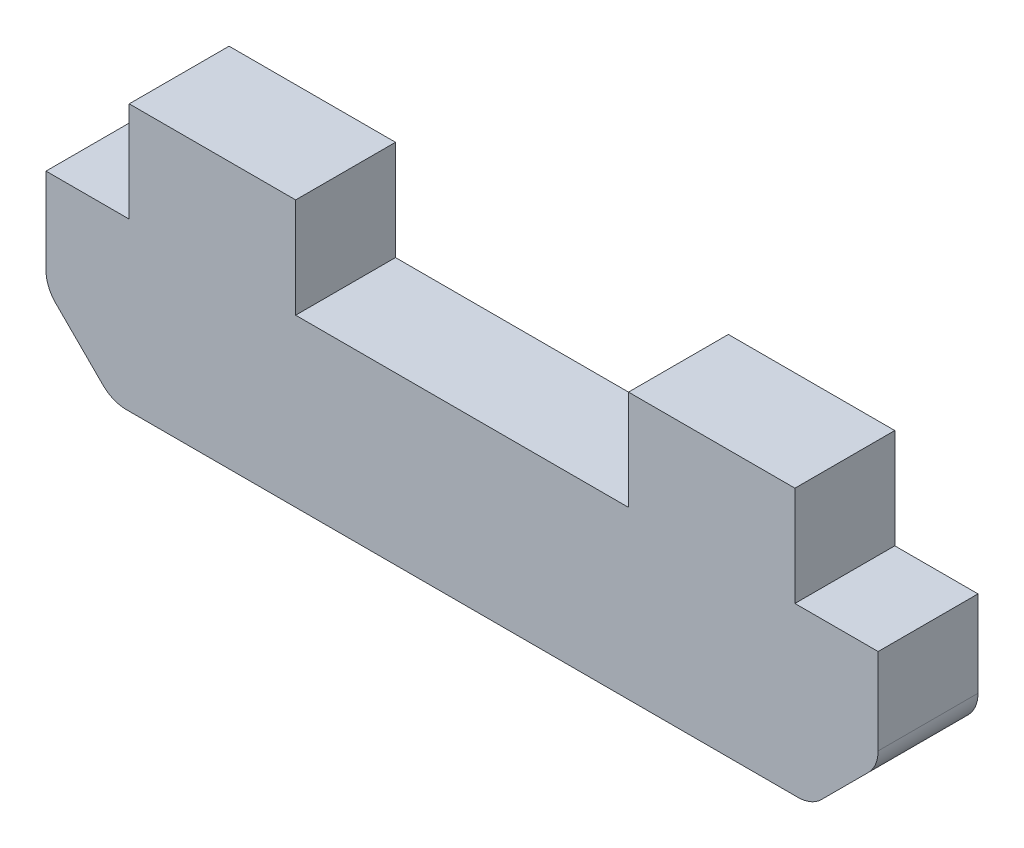
ISO-10303-21;
HEADER;
FILE_DESCRIPTION(('STEP AP214'),'2;1');
FILE_NAME('part.step','',(''),(''),'','','');
FILE_SCHEMA(('AUTOMOTIVE_DESIGN { 1 0 10303 214 1 1 1 1 }'));
ENDSEC;
DATA;
#1=APPLICATION_CONTEXT('core data for automotive mechanical design processes');
#2=APPLICATION_PROTOCOL_DEFINITION('international standard','automotive_design',2000,#1);
#3=PRODUCT_CONTEXT('',#1,'mechanical');
#4=PRODUCT('Part','Part','',(#3));
#5=PRODUCT_RELATED_PRODUCT_CATEGORY('part','',(#4));
#6=PRODUCT_DEFINITION_FORMATION('','',#4);
#7=PRODUCT_DEFINITION_CONTEXT('part definition',#1,'design');
#8=PRODUCT_DEFINITION('design','',#6,#7);
#9=PRODUCT_DEFINITION_SHAPE('','',#8);
#10=(LENGTH_UNIT() NAMED_UNIT(*) SI_UNIT(.MILLI.,.METRE.));
#11=(NAMED_UNIT(*) PLANE_ANGLE_UNIT() SI_UNIT($,.RADIAN.));
#12=(NAMED_UNIT(*) SI_UNIT($,.STERADIAN.) SOLID_ANGLE_UNIT());
#13=UNCERTAINTY_MEASURE_WITH_UNIT(LENGTH_MEASURE(1.E-05),#10,'distance_accuracy_value','');
#14=(GEOMETRIC_REPRESENTATION_CONTEXT(3) GLOBAL_UNCERTAINTY_ASSIGNED_CONTEXT((#13)) GLOBAL_UNIT_ASSIGNED_CONTEXT((#10,
#11,#12)) REPRESENTATION_CONTEXT('',''));
#15=CARTESIAN_POINT('',(0.,0.,0.));
#16=DIRECTION('',(0.,0.,1.));
#17=DIRECTION('',(1.,0.,0.));
#18=AXIS2_PLACEMENT_3D('',#15,#16,#17);
#19=CARTESIAN_POINT('',(0.,5.,3.));
#20=DIRECTION('',(1.,0.,0.));
#21=DIRECTION('',(0.,1.,0.));
#22=AXIS2_PLACEMENT_3D('',#19,#20,#21);
#23=PLANE('',#22);
#24=DIRECTION('',(0.,-1.,0.));
#25=VECTOR('',#24,1.);
#26=CARTESIAN_POINT('',(0.,5.,0.));
#27=LINE('',#26,#25);
#28=CARTESIAN_POINT('',(0.,5.,0.));
#29=VERTEX_POINT('',#28);
#30=CARTESIAN_POINT('',(0.,2.4142135623731,0.));
#31=VERTEX_POINT('',#30);
#32=EDGE_CURVE('E202',#29,#31,#27,.T.);
#33=ORIENTED_EDGE('',*,*,#32,.T.);
#34=DIRECTION('',(0.,0.,-1.));
#35=VECTOR('',#34,1.);
#36=CARTESIAN_POINT('',(0.,2.4142135623731,3.));
#37=LINE('',#36,#35);
#38=CARTESIAN_POINT('',(0.,2.4142135623731,3.));
#39=VERTEX_POINT('',#38);
#40=EDGE_CURVE('E287',#31,#39,#37,.F.);
#41=ORIENTED_EDGE('',*,*,#40,.T.);
#42=DIRECTION('',(0.,-1.,0.));
#43=VECTOR('',#42,1.);
#44=CARTESIAN_POINT('',(0.,5.,3.));
#45=LINE('',#44,#43);
#46=CARTESIAN_POINT('',(0.,5.,3.));
#47=VERTEX_POINT('',#46);
#48=EDGE_CURVE('E227',#47,#39,#45,.T.);
#49=ORIENTED_EDGE('',*,*,#48,.F.);
#50=DIRECTION('',(0.,0.,-1.));
#51=VECTOR('',#50,1.);
#52=CARTESIAN_POINT('',(0.,5.,3.));
#53=LINE('',#52,#51);
#54=EDGE_CURVE('E201',#47,#29,#53,.T.);
#55=ORIENTED_EDGE('',*,*,#54,.T.);
#56=EDGE_LOOP('',(#33,#41,#49,#55));
#57=FACE_BOUND('',#56,.T.);
#58=ADVANCED_FACE('F33',(#57),#23,.F.);
#59=CARTESIAN_POINT('',(0.,0.,3.));
#60=DIRECTION('',(0.,1.,0.));
#61=DIRECTION('',(0.,0.,1.));
#62=AXIS2_PLACEMENT_3D('',#59,#60,#61);
#63=PLANE('',#62);
#64=DIRECTION('',(1.,0.,0.));
#65=VECTOR('',#64,1.);
#66=CARTESIAN_POINT('',(0.,0.,0.));
#67=LINE('',#66,#65);
#68=CARTESIAN_POINT('',(2.41421356237309,0.,0.));
#69=VERTEX_POINT('',#68);
#70=CARTESIAN_POINT('',(22.5857864376269,0.,0.));
#71=VERTEX_POINT('',#70);
#72=EDGE_CURVE('E205',#69,#71,#67,.T.);
#73=ORIENTED_EDGE('',*,*,#72,.T.);
#74=DIRECTION('',(0.,0.,-1.));
#75=VECTOR('',#74,1.);
#76=CARTESIAN_POINT('',(22.5857864376269,0.,3.));
#77=LINE('',#76,#75);
#78=CARTESIAN_POINT('',(22.5857864376269,0.,3.));
#79=VERTEX_POINT('',#78);
#80=EDGE_CURVE('E284',#71,#79,#77,.F.);
#81=ORIENTED_EDGE('',*,*,#80,.T.);
#82=DIRECTION('',(1.,0.,0.));
#83=VECTOR('',#82,1.);
#84=CARTESIAN_POINT('',(0.,0.,3.));
#85=LINE('',#84,#83);
#86=CARTESIAN_POINT('',(2.41421356237309,0.,3.));
#87=VERTEX_POINT('',#86);
#88=EDGE_CURVE('E167',#87,#79,#85,.T.);
#89=ORIENTED_EDGE('',*,*,#88,.F.);
#90=DIRECTION('',(0.,0.,1.));
#91=VECTOR('',#90,1.);
#92=CARTESIAN_POINT('',(2.41421356237309,0.,0.));
#93=LINE('',#92,#91);
#94=EDGE_CURVE('E281',#87,#69,#93,.F.);
#95=ORIENTED_EDGE('',*,*,#94,.T.);
#96=EDGE_LOOP('',(#73,#81,#89,#95));
#97=FACE_BOUND('',#96,.T.);
#98=ADVANCED_FACE('F304',(#97),#63,.F.);
#99=CARTESIAN_POINT('',(25.,0.,3.));
#100=DIRECTION('',(-1.,0.,0.));
#101=DIRECTION('',(0.,0.,1.));
#102=AXIS2_PLACEMENT_3D('',#99,#100,#101);
#103=PLANE('',#102);
#104=DIRECTION('',(0.,1.,0.));
#105=VECTOR('',#104,1.);
#106=CARTESIAN_POINT('',(25.,0.,3.));
#107=LINE('',#106,#105);
#108=CARTESIAN_POINT('',(25.,2.4142135623731,3.));
#109=VERTEX_POINT('',#108);
#110=CARTESIAN_POINT('',(25.,5.,3.));
#111=VERTEX_POINT('',#110);
#112=EDGE_CURVE('E155',#109,#111,#107,.T.);
#113=ORIENTED_EDGE('',*,*,#112,.F.);
#114=DIRECTION('',(0.,0.,1.));
#115=VECTOR('',#114,1.);
#116=CARTESIAN_POINT('',(25.,2.4142135623731,0.));
#117=LINE('',#116,#115);
#118=CARTESIAN_POINT('',(25.,2.4142135623731,0.));
#119=VERTEX_POINT('',#118);
#120=EDGE_CURVE('E261',#109,#119,#117,.F.);
#121=ORIENTED_EDGE('',*,*,#120,.T.);
#122=DIRECTION('',(0.,1.,0.));
#123=VECTOR('',#122,1.);
#124=CARTESIAN_POINT('',(25.,0.,0.));
#125=LINE('',#124,#123);
#126=CARTESIAN_POINT('',(25.,5.,0.));
#127=VERTEX_POINT('',#126);
#128=EDGE_CURVE('E173',#119,#127,#125,.T.);
#129=ORIENTED_EDGE('',*,*,#128,.T.);
#130=DIRECTION('',(0.,0.,-1.));
#131=VECTOR('',#130,1.);
#132=CARTESIAN_POINT('',(25.,5.,3.));
#133=LINE('',#132,#131);
#134=EDGE_CURVE('E170',#111,#127,#133,.T.);
#135=ORIENTED_EDGE('',*,*,#134,.F.);
#136=EDGE_LOOP('',(#113,#121,#129,#135));
#137=FACE_BOUND('',#136,.T.);
#138=ADVANCED_FACE('F171',(#137),#103,.F.);
#139=CARTESIAN_POINT('',(25.,5.,3.));
#140=DIRECTION('',(0.,-1.,0.));
#141=DIRECTION('',(1.,0.,0.));
#142=AXIS2_PLACEMENT_3D('',#139,#140,#141);
#143=PLANE('',#142);
#144=DIRECTION('',(-1.,0.,0.));
#145=VECTOR('',#144,1.);
#146=CARTESIAN_POINT('',(25.,5.,0.));
#147=LINE('',#146,#145);
#148=CARTESIAN_POINT('',(22.5,5.,0.));
#149=VERTEX_POINT('',#148);
#150=EDGE_CURVE('E209',#127,#149,#147,.T.);
#151=ORIENTED_EDGE('',*,*,#150,.T.);
#152=DIRECTION('',(0.,0.,-1.));
#153=VECTOR('',#152,1.);
#154=CARTESIAN_POINT('',(22.5,5.,3.));
#155=LINE('',#154,#153);
#156=CARTESIAN_POINT('',(22.5,5.,3.));
#157=VERTEX_POINT('',#156);
#158=EDGE_CURVE('E177',#157,#149,#155,.T.);
#159=ORIENTED_EDGE('',*,*,#158,.F.);
#160=DIRECTION('',(-1.,0.,0.));
#161=VECTOR('',#160,1.);
#162=CARTESIAN_POINT('',(25.,5.,3.));
#163=LINE('',#162,#161);
#164=EDGE_CURVE('E160',#111,#157,#163,.T.);
#165=ORIENTED_EDGE('',*,*,#164,.F.);
#166=ORIENTED_EDGE('',*,*,#134,.T.);
#167=EDGE_LOOP('',(#151,#159,#165,#166));
#168=FACE_BOUND('',#167,.T.);
#169=ADVANCED_FACE('F179',(#168),#143,.F.);
#170=CARTESIAN_POINT('',(22.5,5.,3.));
#171=DIRECTION('',(-1.,0.,0.));
#172=DIRECTION('',(0.,0.,1.));
#173=AXIS2_PLACEMENT_3D('',#170,#171,#172);
#174=PLANE('',#173);
#175=DIRECTION('',(0.,1.,0.));
#176=VECTOR('',#175,1.);
#177=CARTESIAN_POINT('',(22.5,5.,0.));
#178=LINE('',#177,#176);
#179=CARTESIAN_POINT('',(22.5,8.,0.));
#180=VERTEX_POINT('',#179);
#181=EDGE_CURVE('E211',#149,#180,#178,.T.);
#182=ORIENTED_EDGE('',*,*,#181,.T.);
#183=DIRECTION('',(0.,0.,-1.));
#184=VECTOR('',#183,1.);
#185=CARTESIAN_POINT('',(22.5,8.,3.));
#186=LINE('',#185,#184);
#187=CARTESIAN_POINT('',(22.5,8.,3.));
#188=VERTEX_POINT('',#187);
#189=EDGE_CURVE('E248',#188,#180,#186,.T.);
#190=ORIENTED_EDGE('',*,*,#189,.F.);
#191=DIRECTION('',(0.,1.,0.));
#192=VECTOR('',#191,1.);
#193=CARTESIAN_POINT('',(22.5,5.,3.));
#194=LINE('',#193,#192);
#195=EDGE_CURVE('E182',#157,#188,#194,.T.);
#196=ORIENTED_EDGE('',*,*,#195,.F.);
#197=ORIENTED_EDGE('',*,*,#158,.T.);
#198=EDGE_LOOP('',(#182,#190,#196,#197));
#199=FACE_BOUND('',#198,.T.);
#200=ADVANCED_FACE('F349',(#199),#174,.F.);
#201=CARTESIAN_POINT('',(22.5,8.,3.));
#202=DIRECTION('',(0.,-1.,0.));
#203=DIRECTION('',(0.,0.,-1.));
#204=AXIS2_PLACEMENT_3D('',#201,#202,#203);
#205=PLANE('',#204);
#206=DIRECTION('',(-1.,0.,0.));
#207=VECTOR('',#206,1.);
#208=CARTESIAN_POINT('',(22.5,8.,0.));
#209=LINE('',#208,#207);
#210=CARTESIAN_POINT('',(17.5,8.,0.));
#211=VERTEX_POINT('',#210);
#212=EDGE_CURVE('E213',#180,#211,#209,.T.);
#213=ORIENTED_EDGE('',*,*,#212,.T.);
#214=DIRECTION('',(0.,0.,-1.));
#215=VECTOR('',#214,1.);
#216=CARTESIAN_POINT('',(17.5,8.,3.));
#217=LINE('',#216,#215);
#218=CARTESIAN_POINT('',(17.5,8.,3.));
#219=VERTEX_POINT('',#218);
#220=EDGE_CURVE('E245',#219,#211,#217,.T.);
#221=ORIENTED_EDGE('',*,*,#220,.F.);
#222=DIRECTION('',(-1.,0.,0.));
#223=VECTOR('',#222,1.);
#224=CARTESIAN_POINT('',(22.5,8.,3.));
#225=LINE('',#224,#223);
#226=EDGE_CURVE('E184',#188,#219,#225,.T.);
#227=ORIENTED_EDGE('',*,*,#226,.F.);
#228=ORIENTED_EDGE('',*,*,#189,.T.);
#229=EDGE_LOOP('',(#213,#221,#227,#228));
#230=FACE_BOUND('',#229,.T.);
#231=ADVANCED_FACE('F345',(#230),#205,.F.);
#232=CARTESIAN_POINT('',(17.5,8.,3.));
#233=DIRECTION('',(1.,0.,0.));
#234=DIRECTION('',(0.,0.,-1.));
#235=AXIS2_PLACEMENT_3D('',#232,#233,#234);
#236=PLANE('',#235);
#237=DIRECTION('',(0.,-1.,0.));
#238=VECTOR('',#237,1.);
#239=CARTESIAN_POINT('',(17.5,8.,0.));
#240=LINE('',#239,#238);
#241=CARTESIAN_POINT('',(17.5,5.,0.));
#242=VERTEX_POINT('',#241);
#243=EDGE_CURVE('E215',#211,#242,#240,.T.);
#244=ORIENTED_EDGE('',*,*,#243,.T.);
#245=DIRECTION('',(0.,0.,-1.));
#246=VECTOR('',#245,1.);
#247=CARTESIAN_POINT('',(17.5,5.,3.));
#248=LINE('',#247,#246);
#249=CARTESIAN_POINT('',(17.5,5.,3.));
#250=VERTEX_POINT('',#249);
#251=EDGE_CURVE('E242',#250,#242,#248,.T.);
#252=ORIENTED_EDGE('',*,*,#251,.F.);
#253=DIRECTION('',(0.,-1.,0.));
#254=VECTOR('',#253,1.);
#255=CARTESIAN_POINT('',(17.5,8.,3.));
#256=LINE('',#255,#254);
#257=EDGE_CURVE('E189',#219,#250,#256,.T.);
#258=ORIENTED_EDGE('',*,*,#257,.F.);
#259=ORIENTED_EDGE('',*,*,#220,.T.);
#260=EDGE_LOOP('',(#244,#252,#258,#259));
#261=FACE_BOUND('',#260,.T.);
#262=ADVANCED_FACE('F340',(#261),#236,.F.);
#263=CARTESIAN_POINT('',(17.5,5.,3.));
#264=DIRECTION('',(0.,-1.,0.));
#265=DIRECTION('',(0.,0.,-1.));
#266=AXIS2_PLACEMENT_3D('',#263,#264,#265);
#267=PLANE('',#266);
#268=DIRECTION('',(-1.,0.,0.));
#269=VECTOR('',#268,1.);
#270=CARTESIAN_POINT('',(17.5,5.,0.));
#271=LINE('',#270,#269);
#272=CARTESIAN_POINT('',(7.5,5.,0.));
#273=VERTEX_POINT('',#272);
#274=EDGE_CURVE('E217',#242,#273,#271,.T.);
#275=ORIENTED_EDGE('',*,*,#274,.T.);
#276=DIRECTION('',(0.,0.,-1.));
#277=VECTOR('',#276,1.);
#278=CARTESIAN_POINT('',(7.5,5.,3.));
#279=LINE('',#278,#277);
#280=CARTESIAN_POINT('',(7.5,5.,3.));
#281=VERTEX_POINT('',#280);
#282=EDGE_CURVE('E239',#281,#273,#279,.T.);
#283=ORIENTED_EDGE('',*,*,#282,.F.);
#284=DIRECTION('',(-1.,0.,0.));
#285=VECTOR('',#284,1.);
#286=CARTESIAN_POINT('',(17.5,5.,3.));
#287=LINE('',#286,#285);
#288=EDGE_CURVE('E191',#250,#281,#287,.T.);
#289=ORIENTED_EDGE('',*,*,#288,.F.);
#290=ORIENTED_EDGE('',*,*,#251,.T.);
#291=EDGE_LOOP('',(#275,#283,#289,#290));
#292=FACE_BOUND('',#291,.T.);
#293=ADVANCED_FACE('F336',(#292),#267,.F.);
#294=CARTESIAN_POINT('',(7.5,5.,3.));
#295=DIRECTION('',(-1.,0.,0.));
#296=DIRECTION('',(0.,-1.,0.));
#297=AXIS2_PLACEMENT_3D('',#294,#295,#296);
#298=PLANE('',#297);
#299=DIRECTION('',(0.,1.,0.));
#300=VECTOR('',#299,1.);
#301=CARTESIAN_POINT('',(7.5,5.,0.));
#302=LINE('',#301,#300);
#303=CARTESIAN_POINT('',(7.5,8.,0.));
#304=VERTEX_POINT('',#303);
#305=EDGE_CURVE('E219',#273,#304,#302,.T.);
#306=ORIENTED_EDGE('',*,*,#305,.T.);
#307=DIRECTION('',(0.,0.,-1.));
#308=VECTOR('',#307,1.);
#309=CARTESIAN_POINT('',(7.5,8.,3.));
#310=LINE('',#309,#308);
#311=CARTESIAN_POINT('',(7.5,8.,3.));
#312=VERTEX_POINT('',#311);
#313=EDGE_CURVE('E236',#312,#304,#310,.T.);
#314=ORIENTED_EDGE('',*,*,#313,.F.);
#315=DIRECTION('',(0.,1.,0.));
#316=VECTOR('',#315,1.);
#317=CARTESIAN_POINT('',(7.5,5.,3.));
#318=LINE('',#317,#316);
#319=EDGE_CURVE('E193',#281,#312,#318,.T.);
#320=ORIENTED_EDGE('',*,*,#319,.F.);
#321=ORIENTED_EDGE('',*,*,#282,.T.);
#322=EDGE_LOOP('',(#306,#314,#320,#321));
#323=FACE_BOUND('',#322,.T.);
#324=ADVANCED_FACE('F331',(#323),#298,.F.);
#325=CARTESIAN_POINT('',(7.5,8.,3.));
#326=DIRECTION('',(0.,-1.,0.));
#327=DIRECTION('',(1.,0.,0.));
#328=AXIS2_PLACEMENT_3D('',#325,#326,#327);
#329=PLANE('',#328);
#330=DIRECTION('',(-1.,0.,0.));
#331=VECTOR('',#330,1.);
#332=CARTESIAN_POINT('',(7.5,8.,0.));
#333=LINE('',#332,#331);
#334=CARTESIAN_POINT('',(2.5,8.,0.));
#335=VERTEX_POINT('',#334);
#336=EDGE_CURVE('E221',#304,#335,#333,.T.);
#337=ORIENTED_EDGE('',*,*,#336,.T.);
#338=DIRECTION('',(0.,0.,-1.));
#339=VECTOR('',#338,1.);
#340=CARTESIAN_POINT('',(2.5,8.,3.));
#341=LINE('',#340,#339);
#342=CARTESIAN_POINT('',(2.5,8.,3.));
#343=VERTEX_POINT('',#342);
#344=EDGE_CURVE('E233',#343,#335,#341,.T.);
#345=ORIENTED_EDGE('',*,*,#344,.F.);
#346=DIRECTION('',(-1.,0.,0.));
#347=VECTOR('',#346,1.);
#348=CARTESIAN_POINT('',(7.5,8.,3.));
#349=LINE('',#348,#347);
#350=EDGE_CURVE('E195',#312,#343,#349,.T.);
#351=ORIENTED_EDGE('',*,*,#350,.F.);
#352=ORIENTED_EDGE('',*,*,#313,.T.);
#353=EDGE_LOOP('',(#337,#345,#351,#352));
#354=FACE_BOUND('',#353,.T.);
#355=ADVANCED_FACE('F325',(#354),#329,.F.);
#356=CARTESIAN_POINT('',(2.5,8.,3.));
#357=DIRECTION('',(1.,0.,0.));
#358=DIRECTION('',(0.,1.,0.));
#359=AXIS2_PLACEMENT_3D('',#356,#357,#358);
#360=PLANE('',#359);
#361=DIRECTION('',(0.,-1.,0.));
#362=VECTOR('',#361,1.);
#363=CARTESIAN_POINT('',(2.5,8.,0.));
#364=LINE('',#363,#362);
#365=CARTESIAN_POINT('',(2.5,5.,0.));
#366=VERTEX_POINT('',#365);
#367=EDGE_CURVE('E223',#335,#366,#364,.T.);
#368=ORIENTED_EDGE('',*,*,#367,.T.);
#369=DIRECTION('',(0.,0.,-1.));
#370=VECTOR('',#369,1.);
#371=CARTESIAN_POINT('',(2.5,5.,3.));
#372=LINE('',#371,#370);
#373=CARTESIAN_POINT('',(2.5,5.,3.));
#374=VERTEX_POINT('',#373);
#375=EDGE_CURVE('E230',#374,#366,#372,.T.);
#376=ORIENTED_EDGE('',*,*,#375,.F.);
#377=DIRECTION('',(0.,-1.,0.));
#378=VECTOR('',#377,1.);
#379=CARTESIAN_POINT('',(2.5,8.,3.));
#380=LINE('',#379,#378);
#381=EDGE_CURVE('E197',#343,#374,#380,.T.);
#382=ORIENTED_EDGE('',*,*,#381,.F.);
#383=ORIENTED_EDGE('',*,*,#344,.T.);
#384=EDGE_LOOP('',(#368,#376,#382,#383));
#385=FACE_BOUND('',#384,.T.);
#386=ADVANCED_FACE('F321',(#385),#360,.F.);
#387=CARTESIAN_POINT('',(2.5,5.,3.));
#388=DIRECTION('',(0.,-1.,0.));
#389=DIRECTION('',(1.,0.,0.));
#390=AXIS2_PLACEMENT_3D('',#387,#388,#389);
#391=PLANE('',#390);
#392=DIRECTION('',(-1.,0.,0.));
#393=VECTOR('',#392,1.);
#394=CARTESIAN_POINT('',(2.5,5.,0.));
#395=LINE('',#394,#393);
#396=EDGE_CURVE('E225',#366,#29,#395,.T.);
#397=ORIENTED_EDGE('',*,*,#396,.T.);
#398=ORIENTED_EDGE('',*,*,#54,.F.);
#399=DIRECTION('',(-1.,0.,0.));
#400=VECTOR('',#399,1.);
#401=CARTESIAN_POINT('',(2.5,5.,3.));
#402=LINE('',#401,#400);
#403=EDGE_CURVE('E199',#374,#47,#402,.T.);
#404=ORIENTED_EDGE('',*,*,#403,.F.);
#405=ORIENTED_EDGE('',*,*,#375,.T.);
#406=EDGE_LOOP('',(#397,#398,#404,#405));
#407=FACE_BOUND('',#406,.T.);
#408=ADVANCED_FACE('F317',(#407),#391,.F.);
#409=CARTESIAN_POINT('',(0.,0.,3.));
#410=DIRECTION('',(0.,0.,1.));
#411=DIRECTION('',(1.,0.,0.));
#412=AXIS2_PLACEMENT_3D('',#409,#410,#411);
#413=PLANE('',#412);
#414=DIRECTION('',(-0.707106781186549,-0.707106781186546,0.));
#415=VECTOR('',#414,1.);
#416=CARTESIAN_POINT('',(11.5,-11.5,3.));
#417=LINE('',#416,#415);
#418=CARTESIAN_POINT('',(23.2928932188134,0.292893218813451,3.));
#419=VERTEX_POINT('',#418);
#420=CARTESIAN_POINT('',(24.7071067811865,1.70710678118655,3.));
#421=VERTEX_POINT('',#420);
#422=EDGE_CURVE('E259',#419,#421,#417,.F.);
#423=ORIENTED_EDGE('',*,*,#422,.T.);
#424=CARTESIAN_POINT('',(24.,2.4142135623731,3.));
#425=DIRECTION('',(0.,0.,1.));
#426=DIRECTION('',(1.,0.,0.));
#427=AXIS2_PLACEMENT_3D('',#424,#425,#426);
#428=CIRCLE('',#427,1.);
#429=EDGE_CURVE('E163',#421,#109,#428,.T.);
#430=ORIENTED_EDGE('',*,*,#429,.T.);
#431=ORIENTED_EDGE('',*,*,#112,.T.);
#432=ORIENTED_EDGE('',*,*,#164,.T.);
#433=ORIENTED_EDGE('',*,*,#195,.T.);
#434=ORIENTED_EDGE('',*,*,#226,.T.);
#435=ORIENTED_EDGE('',*,*,#257,.T.);
#436=ORIENTED_EDGE('',*,*,#288,.T.);
#437=ORIENTED_EDGE('',*,*,#319,.T.);
#438=ORIENTED_EDGE('',*,*,#350,.T.);
#439=ORIENTED_EDGE('',*,*,#381,.T.);
#440=ORIENTED_EDGE('',*,*,#403,.T.);
#441=ORIENTED_EDGE('',*,*,#48,.T.);
#442=CARTESIAN_POINT('',(1.,2.4142135623731,3.));
#443=DIRECTION('',(0.,0.,1.));
#444=DIRECTION('',(1.,0.,0.));
#445=AXIS2_PLACEMENT_3D('',#442,#443,#444);
#446=CIRCLE('',#445,1.);
#447=CARTESIAN_POINT('',(0.29289321881345,1.70710678118656,3.));
#448=VERTEX_POINT('',#447);
#449=EDGE_CURVE('E54',#39,#448,#446,.T.);
#450=ORIENTED_EDGE('',*,*,#449,.T.);
#451=DIRECTION('',(-0.707106781186546,0.707106781186549,0.));
#452=VECTOR('',#451,1.);
#453=CARTESIAN_POINT('',(1.,0.999999999999999,3.));
#454=LINE('',#453,#452);
#455=CARTESIAN_POINT('',(1.70710678118655,0.292893218813454,3.));
#456=VERTEX_POINT('',#455);
#457=EDGE_CURVE('E257',#448,#456,#454,.F.);
#458=ORIENTED_EDGE('',*,*,#457,.T.);
#459=CARTESIAN_POINT('',(2.41421356237309,1.,3.));
#460=DIRECTION('',(0.,0.,1.));
#461=DIRECTION('',(1.,0.,0.));
#462=AXIS2_PLACEMENT_3D('',#459,#460,#461);
#463=CIRCLE('',#462,1.);
#464=EDGE_CURVE('E275',#456,#87,#463,.T.);
#465=ORIENTED_EDGE('',*,*,#464,.T.);
#466=ORIENTED_EDGE('',*,*,#88,.T.);
#467=CARTESIAN_POINT('',(22.5857864376269,1.,3.));
#468=DIRECTION('',(0.,0.,1.));
#469=DIRECTION('',(1.,0.,0.));
#470=AXIS2_PLACEMENT_3D('',#467,#468,#469);
#471=CIRCLE('',#470,1.);
#472=EDGE_CURVE('E278',#79,#419,#471,.T.);
#473=ORIENTED_EDGE('',*,*,#472,.T.);
#474=EDGE_LOOP('',(#423,#430,#431,#432,#433,#434,#435,#436,#437,#438,#439,#440,#441,#450,#458,
#465,#466,#473));
#475=FACE_BOUND('',#474,.T.);
#476=ADVANCED_FACE('F158',(#475),#413,.T.);
#477=CARTESIAN_POINT('',(0.,0.,0.));
#478=DIRECTION('',(0.,0.,1.));
#479=DIRECTION('',(1.,0.,0.));
#480=AXIS2_PLACEMENT_3D('',#477,#478,#479);
#481=PLANE('',#480);
#482=ORIENTED_EDGE('',*,*,#128,.F.);
#483=CARTESIAN_POINT('',(24.,2.4142135623731,0.));
#484=DIRECTION('',(0.,0.,1.));
#485=DIRECTION('',(1.,0.,0.));
#486=AXIS2_PLACEMENT_3D('',#483,#484,#485);
#487=CIRCLE('',#486,1.);
#488=CARTESIAN_POINT('',(24.7071067811865,1.70710678118655,0.));
#489=VERTEX_POINT('',#488);
#490=EDGE_CURVE('E269',#119,#489,#487,.F.);
#491=ORIENTED_EDGE('',*,*,#490,.T.);
#492=DIRECTION('',(0.707106781186549,0.707106781186546,0.));
#493=VECTOR('',#492,1.);
#494=CARTESIAN_POINT('',(25.,2.00000000000001,0.));
#495=LINE('',#494,#493);
#496=CARTESIAN_POINT('',(23.2928932188134,0.292893218813451,0.));
#497=VERTEX_POINT('',#496);
#498=EDGE_CURVE('E254',#489,#497,#495,.F.);
#499=ORIENTED_EDGE('',*,*,#498,.T.);
#500=CARTESIAN_POINT('',(22.5857864376269,1.,0.));
#501=DIRECTION('',(0.,0.,1.));
#502=DIRECTION('',(1.,0.,0.));
#503=AXIS2_PLACEMENT_3D('',#500,#501,#502);
#504=CIRCLE('',#503,1.);
#505=EDGE_CURVE('E267',#497,#71,#504,.F.);
#506=ORIENTED_EDGE('',*,*,#505,.T.);
#507=ORIENTED_EDGE('',*,*,#72,.F.);
#508=CARTESIAN_POINT('',(2.41421356237309,1.,0.));
#509=DIRECTION('',(0.,0.,1.));
#510=DIRECTION('',(1.,0.,0.));
#511=AXIS2_PLACEMENT_3D('',#508,#509,#510);
#512=CIRCLE('',#511,1.);
#513=CARTESIAN_POINT('',(1.70710678118655,0.292893218813454,0.));
#514=VERTEX_POINT('',#513);
#515=EDGE_CURVE('E263',#69,#514,#512,.F.);
#516=ORIENTED_EDGE('',*,*,#515,.T.);
#517=DIRECTION('',(0.707106781186546,-0.707106781186549,0.));
#518=VECTOR('',#517,1.);
#519=CARTESIAN_POINT('',(2.,0.,0.));
#520=LINE('',#519,#518);
#521=CARTESIAN_POINT('',(0.29289321881345,1.70710678118656,0.));
#522=VERTEX_POINT('',#521);
#523=EDGE_CURVE('E176',#514,#522,#520,.F.);
#524=ORIENTED_EDGE('',*,*,#523,.T.);
#525=CARTESIAN_POINT('',(1.,2.4142135623731,0.));
#526=DIRECTION('',(0.,0.,1.));
#527=DIRECTION('',(1.,0.,0.));
#528=AXIS2_PLACEMENT_3D('',#525,#526,#527);
#529=CIRCLE('',#528,1.);
#530=EDGE_CURVE('E265',#522,#31,#529,.F.);
#531=ORIENTED_EDGE('',*,*,#530,.T.);
#532=ORIENTED_EDGE('',*,*,#32,.F.);
#533=ORIENTED_EDGE('',*,*,#396,.F.);
#534=ORIENTED_EDGE('',*,*,#367,.F.);
#535=ORIENTED_EDGE('',*,*,#336,.F.);
#536=ORIENTED_EDGE('',*,*,#305,.F.);
#537=ORIENTED_EDGE('',*,*,#274,.F.);
#538=ORIENTED_EDGE('',*,*,#243,.F.);
#539=ORIENTED_EDGE('',*,*,#212,.F.);
#540=ORIENTED_EDGE('',*,*,#181,.F.);
#541=ORIENTED_EDGE('',*,*,#150,.F.);
#542=EDGE_LOOP('',(#482,#491,#499,#506,#507,#516,#524,#531,#532,#533,#534,#535,#536,#537,#538,
#539,#540,#541));
#543=FACE_BOUND('',#542,.T.);
#544=ADVANCED_FACE('F309',(#543),#481,.F.);
#545=CARTESIAN_POINT('',(25.,2.00000000000001,3.));
#546=DIRECTION('',(-0.707106781186546,0.707106781186549,0.));
#547=DIRECTION('',(0.,0.,-1.));
#548=AXIS2_PLACEMENT_3D('',#545,#546,#547);
#549=PLANE('',#548);
#550=ORIENTED_EDGE('',*,*,#498,.F.);
#551=DIRECTION('',(0.,0.,-1.));
#552=VECTOR('',#551,1.);
#553=CARTESIAN_POINT('',(24.7071067811865,1.70710678118655,3.));
#554=LINE('',#553,#552);
#555=EDGE_CURVE('E273',#489,#421,#554,.F.);
#556=ORIENTED_EDGE('',*,*,#555,.T.);
#557=ORIENTED_EDGE('',*,*,#422,.F.);
#558=DIRECTION('',(0.,0.,1.));
#559=VECTOR('',#558,1.);
#560=CARTESIAN_POINT('',(23.2928932188134,0.292893218813452,0.));
#561=LINE('',#560,#559);
#562=EDGE_CURVE('E271',#419,#497,#561,.F.);
#563=ORIENTED_EDGE('',*,*,#562,.T.);
#564=EDGE_LOOP('',(#550,#556,#557,#563));
#565=FACE_BOUND('',#564,.T.);
#566=ADVANCED_FACE('F367',(#565),#549,.F.);
#567=CARTESIAN_POINT('',(2.,0.,3.));
#568=DIRECTION('',(0.707106781186549,0.707106781186546,0.));
#569=DIRECTION('',(0.,0.,-1.));
#570=AXIS2_PLACEMENT_3D('',#567,#568,#569);
#571=PLANE('',#570);
#572=ORIENTED_EDGE('',*,*,#457,.F.);
#573=DIRECTION('',(0.,0.,1.));
#574=VECTOR('',#573,1.);
#575=CARTESIAN_POINT('',(0.292893218813451,1.70710678118656,0.));
#576=LINE('',#575,#574);
#577=EDGE_CURVE('E11',#448,#522,#576,.F.);
#578=ORIENTED_EDGE('',*,*,#577,.T.);
#579=ORIENTED_EDGE('',*,*,#523,.F.);
#580=DIRECTION('',(0.,0.,-1.));
#581=VECTOR('',#580,1.);
#582=CARTESIAN_POINT('',(1.70710678118655,0.292893218813454,3.));
#583=LINE('',#582,#581);
#584=EDGE_CURVE('E41',#514,#456,#583,.F.);
#585=ORIENTED_EDGE('',*,*,#584,.T.);
#586=EDGE_LOOP('',(#572,#578,#579,#585));
#587=FACE_BOUND('',#586,.T.);
#588=ADVANCED_FACE('F310',(#587),#571,.F.);
#589=CARTESIAN_POINT('',(24.,2.4142135623731,3.));
#590=DIRECTION('',(0.,0.,-1.));
#591=DIRECTION('',(-1.,0.,0.));
#592=AXIS2_PLACEMENT_3D('',#589,#590,#591);
#593=CYLINDRICAL_SURFACE('',#592,1.);
#594=ORIENTED_EDGE('',*,*,#429,.F.);
#595=ORIENTED_EDGE('',*,*,#555,.F.);
#596=ORIENTED_EDGE('',*,*,#490,.F.);
#597=ORIENTED_EDGE('',*,*,#120,.F.);
#598=EDGE_LOOP('',(#594,#595,#596,#597));
#599=FACE_BOUND('',#598,.T.);
#600=ADVANCED_FACE('F373',(#599),#593,.T.);
#601=CARTESIAN_POINT('',(22.5857864376269,1.,3.));
#602=DIRECTION('',(0.,0.,1.));
#603=DIRECTION('',(1.,0.,0.));
#604=AXIS2_PLACEMENT_3D('',#601,#602,#603);
#605=CYLINDRICAL_SURFACE('',#604,1.);
#606=ORIENTED_EDGE('',*,*,#505,.F.);
#607=ORIENTED_EDGE('',*,*,#562,.F.);
#608=ORIENTED_EDGE('',*,*,#472,.F.);
#609=ORIENTED_EDGE('',*,*,#80,.F.);
#610=EDGE_LOOP('',(#606,#607,#608,#609));
#611=FACE_BOUND('',#610,.T.);
#612=ADVANCED_FACE('F376',(#611),#605,.T.);
#613=CARTESIAN_POINT('',(1.,2.4142135623731,3.));
#614=DIRECTION('',(0.,0.,1.));
#615=DIRECTION('',(1.,0.,0.));
#616=AXIS2_PLACEMENT_3D('',#613,#614,#615);
#617=CYLINDRICAL_SURFACE('',#616,1.);
#618=ORIENTED_EDGE('',*,*,#530,.F.);
#619=ORIENTED_EDGE('',*,*,#577,.F.);
#620=ORIENTED_EDGE('',*,*,#449,.F.);
#621=ORIENTED_EDGE('',*,*,#40,.F.);
#622=EDGE_LOOP('',(#618,#619,#620,#621));
#623=FACE_BOUND('',#622,.T.);
#624=ADVANCED_FACE('F312',(#623),#617,.T.);
#625=CARTESIAN_POINT('',(2.41421356237309,1.,3.));
#626=DIRECTION('',(0.,0.,-1.));
#627=DIRECTION('',(-1.,0.,0.));
#628=AXIS2_PLACEMENT_3D('',#625,#626,#627);
#629=CYLINDRICAL_SURFACE('',#628,1.);
#630=ORIENTED_EDGE('',*,*,#464,.F.);
#631=ORIENTED_EDGE('',*,*,#584,.F.);
#632=ORIENTED_EDGE('',*,*,#515,.F.);
#633=ORIENTED_EDGE('',*,*,#94,.F.);
#634=EDGE_LOOP('',(#630,#631,#632,#633));
#635=FACE_BOUND('',#634,.T.);
#636=ADVANCED_FACE('F35',(#635),#629,.T.);
#637=CLOSED_SHELL('',(#58,#98,#138,#169,#200,#231,#262,#293,#324,#355,#386,#408,#476,#544,#566,
#588,#600,#612,#624,#636));
#638=MANIFOLD_SOLID_BREP('B2',#637);
#639=ADVANCED_BREP_SHAPE_REPRESENTATION('',(#18,#638),#14);
#640=SHAPE_DEFINITION_REPRESENTATION(#9,#639);
ENDSEC;
END-ISO-10303-21;
